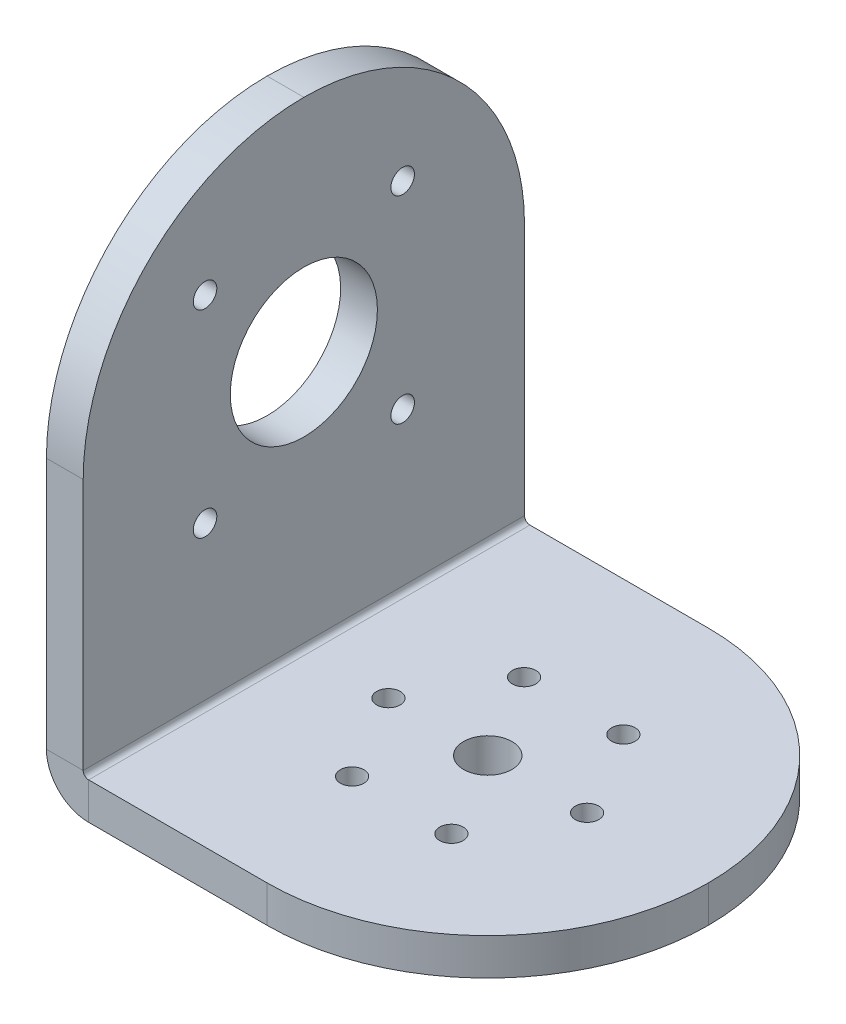
ISO-10303-21;
HEADER;
FILE_DESCRIPTION(('STEP AP214'),'2;1');
FILE_NAME('part.step','',(''),(''),'','','');
FILE_SCHEMA(('AUTOMOTIVE_DESIGN { 1 0 10303 214 1 1 1 1 }'));
ENDSEC;
DATA;
#1=APPLICATION_CONTEXT('core data for automotive mechanical design processes');
#2=APPLICATION_PROTOCOL_DEFINITION('international standard','automotive_design',2000,#1);
#3=PRODUCT_CONTEXT('',#1,'mechanical');
#4=PRODUCT('Part','Part','',(#3));
#5=PRODUCT_RELATED_PRODUCT_CATEGORY('part','',(#4));
#6=PRODUCT_DEFINITION_FORMATION('','',#4);
#7=PRODUCT_DEFINITION_CONTEXT('part definition',#1,'design');
#8=PRODUCT_DEFINITION('design','',#6,#7);
#9=PRODUCT_DEFINITION_SHAPE('','',#8);
#10=(LENGTH_UNIT() NAMED_UNIT(*) SI_UNIT(.MILLI.,.METRE.));
#11=(NAMED_UNIT(*) PLANE_ANGLE_UNIT() SI_UNIT($,.RADIAN.));
#12=(NAMED_UNIT(*) SI_UNIT($,.STERADIAN.) SOLID_ANGLE_UNIT());
#13=UNCERTAINTY_MEASURE_WITH_UNIT(LENGTH_MEASURE(1.E-05),#10,'distance_accuracy_value','');
#14=(GEOMETRIC_REPRESENTATION_CONTEXT(3) GLOBAL_UNCERTAINTY_ASSIGNED_CONTEXT((#13)) GLOBAL_UNIT_ASSIGNED_CONTEXT((#10,
#11,#12)) REPRESENTATION_CONTEXT('',''));
#15=CARTESIAN_POINT('',(0.,0.,0.));
#16=DIRECTION('',(0.,0.,1.));
#17=DIRECTION('',(1.,0.,0.));
#18=AXIS2_PLACEMENT_3D('',#15,#16,#17);
#19=CARTESIAN_POINT('',(0.,70.,30.));
#20=DIRECTION('',(1.,0.,0.));
#21=DIRECTION('',(0.,1.,0.));
#22=AXIS2_PLACEMENT_3D('',#19,#20,#21);
#23=PLANE('',#22);
#24=CARTESIAN_POINT('',(0.,53.4350288425444,-13.4350288425444));
#25=DIRECTION('',(-1.,0.,0.));
#26=DIRECTION('',(0.,0.,1.));
#27=AXIS2_PLACEMENT_3D('',#24,#25,#26);
#28=CIRCLE('',#27,1.60000000000002);
#29=CARTESIAN_POINT('',(0.,53.4350288425444,-11.8350288425444));
#30=VERTEX_POINT('',#29);
#31=EDGE_CURVE('E308',#30,#30,#28,.T.);
#32=ORIENTED_EDGE('',*,*,#31,.F.);
#33=EDGE_LOOP('',(#32));
#34=FACE_BOUND('',#33,.T.);
#35=CARTESIAN_POINT('',(0.,26.5649711574556,-13.4350288425444));
#36=DIRECTION('',(-1.,0.,0.));
#37=DIRECTION('',(0.,0.,1.));
#38=AXIS2_PLACEMENT_3D('',#35,#36,#37);
#39=CIRCLE('',#38,1.60000000000001);
#40=CARTESIAN_POINT('',(0.,26.5649711574556,-11.8350288425444));
#41=VERTEX_POINT('',#40);
#42=EDGE_CURVE('E302',#41,#41,#39,.T.);
#43=ORIENTED_EDGE('',*,*,#42,.F.);
#44=EDGE_LOOP('',(#43));
#45=FACE_BOUND('',#44,.T.);
#46=CARTESIAN_POINT('',(0.,26.5649711574556,13.4350288425444));
#47=DIRECTION('',(-1.,0.,0.));
#48=DIRECTION('',(0.,0.,1.));
#49=AXIS2_PLACEMENT_3D('',#46,#47,#48);
#50=CIRCLE('',#49,1.60000000000001);
#51=CARTESIAN_POINT('',(0.,26.5649711574556,15.0350288425444));
#52=VERTEX_POINT('',#51);
#53=EDGE_CURVE('E296',#52,#52,#50,.T.);
#54=ORIENTED_EDGE('',*,*,#53,.F.);
#55=EDGE_LOOP('',(#54));
#56=FACE_BOUND('',#55,.T.);
#57=CARTESIAN_POINT('',(0.,40.,0.));
#58=DIRECTION('',(-1.,0.,0.));
#59=DIRECTION('',(0.,-1.,0.));
#60=AXIS2_PLACEMENT_3D('',#57,#58,#59);
#61=CIRCLE('',#60,10.);
#62=CARTESIAN_POINT('',(0.,30.,0.));
#63=VERTEX_POINT('',#62);
#64=EDGE_CURVE('E290',#63,#63,#61,.T.);
#65=ORIENTED_EDGE('',*,*,#64,.F.);
#66=EDGE_LOOP('',(#65));
#67=FACE_BOUND('',#66,.T.);
#68=CARTESIAN_POINT('',(0.,40.,0.));
#69=DIRECTION('',(1.,0.,0.));
#70=DIRECTION('',(0.,1.,0.));
#71=AXIS2_PLACEMENT_3D('',#68,#69,#70);
#72=CIRCLE('',#71,30.);
#73=CARTESIAN_POINT('',(0.,40.,30.));
#74=VERTEX_POINT('',#73);
#75=CARTESIAN_POINT('',(0.,70.,0.));
#76=VERTEX_POINT('',#75);
#77=EDGE_CURVE('E60',#74,#76,#72,.F.);
#78=ORIENTED_EDGE('',*,*,#77,.T.);
#79=CARTESIAN_POINT('',(0.,40.,0.));
#80=DIRECTION('',(1.,0.,0.));
#81=DIRECTION('',(0.,1.,0.));
#82=AXIS2_PLACEMENT_3D('',#79,#80,#81);
#83=CIRCLE('',#82,30.);
#84=CARTESIAN_POINT('',(0.,40.,-30.));
#85=VERTEX_POINT('',#84);
#86=EDGE_CURVE('E52',#76,#85,#83,.F.);
#87=ORIENTED_EDGE('',*,*,#86,.T.);
#88=DIRECTION('',(0.,-1.,0.));
#89=VECTOR('',#88,1.);
#90=CARTESIAN_POINT('',(0.,70.,-30.));
#91=LINE('',#90,#89);
#92=CARTESIAN_POINT('',(0.,5.73659999999999,-30.));
#93=VERTEX_POINT('',#92);
#94=EDGE_CURVE('E178',#85,#93,#91,.T.);
#95=ORIENTED_EDGE('',*,*,#94,.T.);
#96=DIRECTION('',(0.,0.,-1.));
#97=VECTOR('',#96,1.);
#98=CARTESIAN_POINT('',(0.,5.73659999999999,30.));
#99=LINE('',#98,#97);
#100=CARTESIAN_POINT('',(0.,5.73659999999999,30.));
#101=VERTEX_POINT('',#100);
#102=EDGE_CURVE('E185',#101,#93,#99,.T.);
#103=ORIENTED_EDGE('',*,*,#102,.F.);
#104=DIRECTION('',(0.,-1.,0.));
#105=VECTOR('',#104,1.);
#106=CARTESIAN_POINT('',(0.,70.,30.));
#107=LINE('',#106,#105);
#108=EDGE_CURVE('E162',#74,#101,#107,.T.);
#109=ORIENTED_EDGE('',*,*,#108,.F.);
#110=EDGE_LOOP('',(#78,#87,#95,#103,#109));
#111=FACE_BOUND('',#110,.T.);
#112=CARTESIAN_POINT('',(0.,53.4350288425444,13.4350288425444));
#113=DIRECTION('',(-1.,0.,0.));
#114=DIRECTION('',(0.,0.,1.));
#115=AXIS2_PLACEMENT_3D('',#112,#113,#114);
#116=CIRCLE('',#115,1.60000000000002);
#117=CARTESIAN_POINT('',(0.,53.4350288425444,15.0350288425444));
#118=VERTEX_POINT('',#117);
#119=EDGE_CURVE('E216',#118,#118,#116,.T.);
#120=ORIENTED_EDGE('',*,*,#119,.F.);
#121=EDGE_LOOP('',(#120));
#122=FACE_BOUND('',#121,.T.);
#123=ADVANCED_FACE('F43',(#34,#45,#56,#67,#111,#122),#23,.F.);
#124=CARTESIAN_POINT('',(0.,5.73659999999999,30.));
#125=DIRECTION('',(0.,0.,1.));
#126=DIRECTION('',(1.,0.,0.));
#127=AXIS2_PLACEMENT_3D('',#124,#125,#126);
#128=PLANE('',#127);
#129=DIRECTION('',(1.,0.,0.));
#130=VECTOR('',#129,1.);
#131=CARTESIAN_POINT('',(0.,5.73659999999999,30.));
#132=LINE('',#131,#130);
#133=CARTESIAN_POINT('',(5.,5.7366,30.));
#134=VERTEX_POINT('',#133);
#135=EDGE_CURVE('E133',#101,#134,#132,.T.);
#136=ORIENTED_EDGE('',*,*,#135,.F.);
#137=CARTESIAN_POINT('',(5.7366,5.7366,30.));
#138=DIRECTION('',(0.,0.,1.));
#139=DIRECTION('',(1.,0.,0.));
#140=AXIS2_PLACEMENT_3D('',#137,#138,#139);
#141=CIRCLE('',#140,5.7366);
#142=CARTESIAN_POINT('',(5.7366,0.,30.));
#143=VERTEX_POINT('',#142);
#144=EDGE_CURVE('E128',#101,#143,#141,.T.);
#145=ORIENTED_EDGE('',*,*,#144,.T.);
#146=DIRECTION('',(0.,-1.,0.));
#147=VECTOR('',#146,1.);
#148=CARTESIAN_POINT('',(5.7366,5.,30.));
#149=LINE('',#148,#147);
#150=CARTESIAN_POINT('',(5.7366,5.,30.));
#151=VERTEX_POINT('',#150);
#152=EDGE_CURVE('E121',#151,#143,#149,.T.);
#153=ORIENTED_EDGE('',*,*,#152,.F.);
#154=CARTESIAN_POINT('',(5.7366,5.7366,30.));
#155=DIRECTION('',(0.,0.,1.));
#156=DIRECTION('',(1.,0.,0.));
#157=AXIS2_PLACEMENT_3D('',#154,#155,#156);
#158=CIRCLE('',#157,0.7366);
#159=EDGE_CURVE('E126',#134,#151,#158,.T.);
#160=ORIENTED_EDGE('',*,*,#159,.F.);
#161=EDGE_LOOP('',(#136,#145,#153,#160));
#162=FACE_BOUND('',#161,.T.);
#163=ADVANCED_FACE('F124',(#162),#128,.T.);
#164=CARTESIAN_POINT('',(5.7366,5.,30.));
#165=DIRECTION('',(0.,0.,1.));
#166=DIRECTION('',(1.,0.,0.));
#167=AXIS2_PLACEMENT_3D('',#164,#165,#166);
#168=PLANE('',#167);
#169=DIRECTION('',(0.,-1.,0.));
#170=VECTOR('',#169,1.);
#171=CARTESIAN_POINT('',(5.,70.,30.));
#172=LINE('',#171,#170);
#173=CARTESIAN_POINT('',(5.,40.,30.));
#174=VERTEX_POINT('',#173);
#175=EDGE_CURVE('E160',#174,#134,#172,.T.);
#176=ORIENTED_EDGE('',*,*,#175,.F.);
#177=DIRECTION('',(1.,0.,0.));
#178=VECTOR('',#177,1.);
#179=CARTESIAN_POINT('',(5.7366,40.,30.));
#180=LINE('',#179,#178);
#181=EDGE_CURVE('E11',#174,#74,#180,.F.);
#182=ORIENTED_EDGE('',*,*,#181,.T.);
#183=ORIENTED_EDGE('',*,*,#108,.T.);
#184=ORIENTED_EDGE('',*,*,#135,.T.);
#185=EDGE_LOOP('',(#176,#182,#183,#184));
#186=FACE_BOUND('',#185,.T.);
#187=ADVANCED_FACE('F233',(#186),#168,.T.);
#188=CARTESIAN_POINT('',(5.7366,0.,-30.));
#189=DIRECTION('',(0.,0.,-1.));
#190=DIRECTION('',(-1.,0.,0.));
#191=AXIS2_PLACEMENT_3D('',#188,#189,#190);
#192=PLANE('',#191);
#193=DIRECTION('',(0.,1.,0.));
#194=VECTOR('',#193,1.);
#195=CARTESIAN_POINT('',(5.7366,0.,-30.));
#196=LINE('',#195,#194);
#197=CARTESIAN_POINT('',(5.7366,0.,-30.));
#198=VERTEX_POINT('',#197);
#199=CARTESIAN_POINT('',(5.7366,5.,-30.));
#200=VERTEX_POINT('',#199);
#201=EDGE_CURVE('E134',#198,#200,#196,.T.);
#202=ORIENTED_EDGE('',*,*,#201,.F.);
#203=CARTESIAN_POINT('',(5.7366,5.7366,-30.));
#204=DIRECTION('',(0.,0.,1.));
#205=DIRECTION('',(1.,0.,0.));
#206=AXIS2_PLACEMENT_3D('',#203,#204,#205);
#207=CIRCLE('',#206,5.7366);
#208=EDGE_CURVE('E180',#93,#198,#207,.T.);
#209=ORIENTED_EDGE('',*,*,#208,.F.);
#210=DIRECTION('',(-1.,0.,0.));
#211=VECTOR('',#210,1.);
#212=CARTESIAN_POINT('',(5.,5.7366,-30.));
#213=LINE('',#212,#211);
#214=CARTESIAN_POINT('',(5.,5.7366,-30.));
#215=VERTEX_POINT('',#214);
#216=EDGE_CURVE('E149',#215,#93,#213,.T.);
#217=ORIENTED_EDGE('',*,*,#216,.F.);
#218=CARTESIAN_POINT('',(5.7366,5.7366,-30.));
#219=DIRECTION('',(0.,0.,1.));
#220=DIRECTION('',(1.,0.,0.));
#221=AXIS2_PLACEMENT_3D('',#218,#219,#220);
#222=CIRCLE('',#221,0.7366);
#223=EDGE_CURVE('E174',#215,#200,#222,.T.);
#224=ORIENTED_EDGE('',*,*,#223,.T.);
#225=EDGE_LOOP('',(#202,#209,#217,#224));
#226=FACE_BOUND('',#225,.T.);
#227=ADVANCED_FACE('F360',(#226),#192,.T.);
#228=CARTESIAN_POINT('',(5.,5.7366,-30.));
#229=DIRECTION('',(0.,0.,-1.));
#230=DIRECTION('',(-1.,0.,0.));
#231=AXIS2_PLACEMENT_3D('',#228,#229,#230);
#232=PLANE('',#231);
#233=DIRECTION('',(1.,0.,0.));
#234=VECTOR('',#233,1.);
#235=CARTESIAN_POINT('',(60.,5.,-30.));
#236=LINE('',#235,#234);
#237=CARTESIAN_POINT('',(30.,5.,-30.));
#238=VERTEX_POINT('',#237);
#239=EDGE_CURVE('E145',#200,#238,#236,.T.);
#240=ORIENTED_EDGE('',*,*,#239,.T.);
#241=DIRECTION('',(0.,-1.,0.));
#242=VECTOR('',#241,1.);
#243=CARTESIAN_POINT('',(30.,5.7366,-30.));
#244=LINE('',#243,#242);
#245=CARTESIAN_POINT('',(30.,0.,-30.));
#246=VERTEX_POINT('',#245);
#247=EDGE_CURVE('E194',#238,#246,#244,.T.);
#248=ORIENTED_EDGE('',*,*,#247,.T.);
#249=DIRECTION('',(1.,0.,0.));
#250=VECTOR('',#249,1.);
#251=CARTESIAN_POINT('',(60.,0.,-30.));
#252=LINE('',#251,#250);
#253=EDGE_CURVE('E169',#198,#246,#252,.T.);
#254=ORIENTED_EDGE('',*,*,#253,.F.);
#255=ORIENTED_EDGE('',*,*,#201,.T.);
#256=EDGE_LOOP('',(#240,#248,#254,#255));
#257=FACE_BOUND('',#256,.T.);
#258=ADVANCED_FACE('F356',(#257),#232,.T.);
#259=CARTESIAN_POINT('',(60.,0.,30.));
#260=DIRECTION('',(0.,1.,0.));
#261=DIRECTION('',(-1.,0.,0.));
#262=AXIS2_PLACEMENT_3D('',#259,#260,#261);
#263=PLANE('',#262);
#264=CARTESIAN_POINT('',(36.75,0.,11.6913429510899));
#265=DIRECTION('',(0.,1.,0.));
#266=DIRECTION('',(-1.,0.,0.));
#267=AXIS2_PLACEMENT_3D('',#264,#265,#266);
#268=CIRCLE('',#267,1.60000000000001);
#269=CARTESIAN_POINT('',(35.15,0.,11.6913429510899));
#270=VERTEX_POINT('',#269);
#271=EDGE_CURVE('E281',#270,#270,#268,.T.);
#272=ORIENTED_EDGE('',*,*,#271,.T.);
#273=EDGE_LOOP('',(#272));
#274=FACE_BOUND('',#273,.T.);
#275=CARTESIAN_POINT('',(43.5,0.,0.));
#276=DIRECTION('',(0.,1.,0.));
#277=DIRECTION('',(-1.,0.,0.));
#278=AXIS2_PLACEMENT_3D('',#275,#276,#277);
#279=CIRCLE('',#278,1.60000000000001);
#280=CARTESIAN_POINT('',(41.9,0.,0.));
#281=VERTEX_POINT('',#280);
#282=EDGE_CURVE('E275',#281,#281,#279,.T.);
#283=ORIENTED_EDGE('',*,*,#282,.T.);
#284=EDGE_LOOP('',(#283));
#285=FACE_BOUND('',#284,.T.);
#286=CARTESIAN_POINT('',(36.75,0.,-11.6913429510899));
#287=DIRECTION('',(0.,1.,0.));
#288=DIRECTION('',(-1.,0.,0.));
#289=AXIS2_PLACEMENT_3D('',#286,#287,#288);
#290=CIRCLE('',#289,1.60000000000001);
#291=CARTESIAN_POINT('',(35.15,0.,-11.6913429510899));
#292=VERTEX_POINT('',#291);
#293=EDGE_CURVE('E269',#292,#292,#290,.T.);
#294=ORIENTED_EDGE('',*,*,#293,.T.);
#295=EDGE_LOOP('',(#294));
#296=FACE_BOUND('',#295,.T.);
#297=CARTESIAN_POINT('',(23.25,0.,-11.6913429510899));
#298=DIRECTION('',(0.,1.,0.));
#299=DIRECTION('',(-1.,0.,0.));
#300=AXIS2_PLACEMENT_3D('',#297,#298,#299);
#301=CIRCLE('',#300,1.60000000000001);
#302=CARTESIAN_POINT('',(21.65,0.,-11.6913429510899));
#303=VERTEX_POINT('',#302);
#304=EDGE_CURVE('E263',#303,#303,#301,.T.);
#305=ORIENTED_EDGE('',*,*,#304,.T.);
#306=EDGE_LOOP('',(#305));
#307=FACE_BOUND('',#306,.T.);
#308=CARTESIAN_POINT('',(16.5,0.,0.));
#309=DIRECTION('',(0.,1.,0.));
#310=DIRECTION('',(-1.,0.,0.));
#311=AXIS2_PLACEMENT_3D('',#308,#309,#310);
#312=CIRCLE('',#311,1.60000000000001);
#313=CARTESIAN_POINT('',(14.9,0.,0.));
#314=VERTEX_POINT('',#313);
#315=EDGE_CURVE('E257',#314,#314,#312,.T.);
#316=ORIENTED_EDGE('',*,*,#315,.T.);
#317=EDGE_LOOP('',(#316));
#318=FACE_BOUND('',#317,.T.);
#319=CARTESIAN_POINT('',(23.25,0.,11.6913429510899));
#320=DIRECTION('',(0.,1.,0.));
#321=DIRECTION('',(-1.,0.,0.));
#322=AXIS2_PLACEMENT_3D('',#319,#320,#321);
#323=CIRCLE('',#322,1.60000000000001);
#324=CARTESIAN_POINT('',(21.65,0.,11.6913429510899));
#325=VERTEX_POINT('',#324);
#326=EDGE_CURVE('E251',#325,#325,#323,.T.);
#327=ORIENTED_EDGE('',*,*,#326,.T.);
#328=EDGE_LOOP('',(#327));
#329=FACE_BOUND('',#328,.T.);
#330=CARTESIAN_POINT('',(30.,0.,0.));
#331=DIRECTION('',(0.,1.,0.));
#332=DIRECTION('',(-1.,0.,0.));
#333=AXIS2_PLACEMENT_3D('',#330,#331,#332);
#334=CIRCLE('',#333,3.29337322835061);
#335=CARTESIAN_POINT('',(26.7066267716494,0.,0.));
#336=VERTEX_POINT('',#335);
#337=EDGE_CURVE('E172',#336,#336,#334,.T.);
#338=ORIENTED_EDGE('',*,*,#337,.T.);
#339=EDGE_LOOP('',(#338));
#340=FACE_BOUND('',#339,.T.);
#341=ORIENTED_EDGE('',*,*,#253,.T.);
#342=CARTESIAN_POINT('',(30.,0.,0.));
#343=DIRECTION('',(0.,1.,0.));
#344=DIRECTION('',(-1.,0.,0.));
#345=AXIS2_PLACEMENT_3D('',#342,#343,#344);
#346=CIRCLE('',#345,30.);
#347=CARTESIAN_POINT('',(60.,0.,0.));
#348=VERTEX_POINT('',#347);
#349=EDGE_CURVE('E199',#246,#348,#346,.F.);
#350=ORIENTED_EDGE('',*,*,#349,.T.);
#351=CARTESIAN_POINT('',(30.,0.,0.));
#352=DIRECTION('',(0.,1.,0.));
#353=DIRECTION('',(-1.,0.,0.));
#354=AXIS2_PLACEMENT_3D('',#351,#352,#353);
#355=CIRCLE('',#354,30.);
#356=CARTESIAN_POINT('',(30.,0.,30.));
#357=VERTEX_POINT('',#356);
#358=EDGE_CURVE('E197',#348,#357,#355,.F.);
#359=ORIENTED_EDGE('',*,*,#358,.T.);
#360=DIRECTION('',(1.,0.,0.));
#361=VECTOR('',#360,1.);
#362=CARTESIAN_POINT('',(60.,0.,30.));
#363=LINE('',#362,#361);
#364=EDGE_CURVE('E155',#143,#357,#363,.T.);
#365=ORIENTED_EDGE('',*,*,#364,.F.);
#366=DIRECTION('',(0.,0.,-1.));
#367=VECTOR('',#366,1.);
#368=CARTESIAN_POINT('',(5.7366,0.,30.));
#369=LINE('',#368,#367);
#370=EDGE_CURVE('E168',#143,#198,#369,.T.);
#371=ORIENTED_EDGE('',*,*,#370,.T.);
#372=EDGE_LOOP('',(#341,#350,#359,#365,#371));
#373=FACE_BOUND('',#372,.T.);
#374=ADVANCED_FACE('F243',(#274,#285,#296,#307,#318,#329,#340,#373),#263,.F.);
#375=CARTESIAN_POINT('',(60.,5.,30.));
#376=DIRECTION('',(0.,1.,0.));
#377=DIRECTION('',(-1.,0.,0.));
#378=AXIS2_PLACEMENT_3D('',#375,#376,#377);
#379=PLANE('',#378);
#380=CARTESIAN_POINT('',(36.75,5.,11.6913429510899));
#381=DIRECTION('',(0.,1.,0.));
#382=DIRECTION('',(0.,0.,1.));
#383=AXIS2_PLACEMENT_3D('',#380,#381,#382);
#384=CIRCLE('',#383,1.60000000000001);
#385=CARTESIAN_POINT('',(36.75,5.,13.2913429510899));
#386=VERTEX_POINT('',#385);
#387=EDGE_CURVE('E284',#386,#386,#384,.T.);
#388=ORIENTED_EDGE('',*,*,#387,.F.);
#389=EDGE_LOOP('',(#388));
#390=FACE_BOUND('',#389,.T.);
#391=CARTESIAN_POINT('',(43.5,5.,0.));
#392=DIRECTION('',(0.,1.,0.));
#393=DIRECTION('',(0.,0.,1.));
#394=AXIS2_PLACEMENT_3D('',#391,#392,#393);
#395=CIRCLE('',#394,1.60000000000002);
#396=CARTESIAN_POINT('',(43.5,5.,1.60000000000003));
#397=VERTEX_POINT('',#396);
#398=EDGE_CURVE('E278',#397,#397,#395,.T.);
#399=ORIENTED_EDGE('',*,*,#398,.F.);
#400=EDGE_LOOP('',(#399));
#401=FACE_BOUND('',#400,.T.);
#402=CARTESIAN_POINT('',(36.75,5.,-11.6913429510899));
#403=DIRECTION('',(0.,1.,0.));
#404=DIRECTION('',(0.,0.,1.));
#405=AXIS2_PLACEMENT_3D('',#402,#403,#404);
#406=CIRCLE('',#405,1.60000000000002);
#407=CARTESIAN_POINT('',(36.75,5.,-10.0913429510899));
#408=VERTEX_POINT('',#407);
#409=EDGE_CURVE('E272',#408,#408,#406,.T.);
#410=ORIENTED_EDGE('',*,*,#409,.F.);
#411=EDGE_LOOP('',(#410));
#412=FACE_BOUND('',#411,.T.);
#413=CARTESIAN_POINT('',(23.25,5.,-11.6913429510899));
#414=DIRECTION('',(0.,1.,0.));
#415=DIRECTION('',(0.,0.,1.));
#416=AXIS2_PLACEMENT_3D('',#413,#414,#415);
#417=CIRCLE('',#416,1.60000000000001);
#418=CARTESIAN_POINT('',(23.25,5.,-10.0913429510899));
#419=VERTEX_POINT('',#418);
#420=EDGE_CURVE('E266',#419,#419,#417,.T.);
#421=ORIENTED_EDGE('',*,*,#420,.F.);
#422=EDGE_LOOP('',(#421));
#423=FACE_BOUND('',#422,.T.);
#424=CARTESIAN_POINT('',(16.5,5.,0.));
#425=DIRECTION('',(0.,1.,0.));
#426=DIRECTION('',(0.,0.,1.));
#427=AXIS2_PLACEMENT_3D('',#424,#425,#426);
#428=CIRCLE('',#427,1.60000000000001);
#429=CARTESIAN_POINT('',(16.5,5.,1.60000000000001));
#430=VERTEX_POINT('',#429);
#431=EDGE_CURVE('E260',#430,#430,#428,.T.);
#432=ORIENTED_EDGE('',*,*,#431,.F.);
#433=EDGE_LOOP('',(#432));
#434=FACE_BOUND('',#433,.T.);
#435=CARTESIAN_POINT('',(23.25,5.,11.6913429510899));
#436=DIRECTION('',(0.,1.,0.));
#437=DIRECTION('',(0.,0.,1.));
#438=AXIS2_PLACEMENT_3D('',#435,#436,#437);
#439=CIRCLE('',#438,1.60000000000001);
#440=CARTESIAN_POINT('',(23.25,5.,13.2913429510899));
#441=VERTEX_POINT('',#440);
#442=EDGE_CURVE('E254',#441,#441,#439,.T.);
#443=ORIENTED_EDGE('',*,*,#442,.F.);
#444=EDGE_LOOP('',(#443));
#445=FACE_BOUND('',#444,.T.);
#446=CARTESIAN_POINT('',(30.,5.,0.));
#447=DIRECTION('',(0.,1.,0.));
#448=DIRECTION('',(-1.,0.,0.));
#449=AXIS2_PLACEMENT_3D('',#446,#447,#448);
#450=CIRCLE('',#449,3.29337322835061);
#451=CARTESIAN_POINT('',(26.7066267716494,5.,0.));
#452=VERTEX_POINT('',#451);
#453=EDGE_CURVE('E248',#452,#452,#450,.T.);
#454=ORIENTED_EDGE('',*,*,#453,.F.);
#455=EDGE_LOOP('',(#454));
#456=FACE_BOUND('',#455,.T.);
#457=CARTESIAN_POINT('',(30.,5.,0.));
#458=DIRECTION('',(0.,1.,0.));
#459=DIRECTION('',(-1.,0.,0.));
#460=AXIS2_PLACEMENT_3D('',#457,#458,#459);
#461=CIRCLE('',#460,30.);
#462=CARTESIAN_POINT('',(30.,5.,30.));
#463=VERTEX_POINT('',#462);
#464=CARTESIAN_POINT('',(60.,5.,0.));
#465=VERTEX_POINT('',#464);
#466=EDGE_CURVE('E201',#463,#465,#461,.T.);
#467=ORIENTED_EDGE('',*,*,#466,.T.);
#468=CARTESIAN_POINT('',(30.,5.,0.));
#469=DIRECTION('',(0.,1.,0.));
#470=DIRECTION('',(-1.,0.,0.));
#471=AXIS2_PLACEMENT_3D('',#468,#469,#470);
#472=CIRCLE('',#471,30.);
#473=EDGE_CURVE('E203',#465,#238,#472,.T.);
#474=ORIENTED_EDGE('',*,*,#473,.T.);
#475=ORIENTED_EDGE('',*,*,#239,.F.);
#476=DIRECTION('',(0.,0.,-1.));
#477=VECTOR('',#476,1.);
#478=CARTESIAN_POINT('',(5.7366,5.,30.));
#479=LINE('',#478,#477);
#480=EDGE_CURVE('E140',#151,#200,#479,.T.);
#481=ORIENTED_EDGE('',*,*,#480,.F.);
#482=DIRECTION('',(1.,0.,0.));
#483=VECTOR('',#482,1.);
#484=CARTESIAN_POINT('',(60.,5.,30.));
#485=LINE('',#484,#483);
#486=EDGE_CURVE('E142',#151,#463,#485,.T.);
#487=ORIENTED_EDGE('',*,*,#486,.T.);
#488=EDGE_LOOP('',(#467,#474,#475,#481,#487));
#489=FACE_BOUND('',#488,.T.);
#490=ADVANCED_FACE('F141',(#390,#401,#412,#423,#434,#445,#456,#489),#379,.T.);
#491=CARTESIAN_POINT('',(5.7366,5.7366,30.));
#492=DIRECTION('',(0.,0.,-1.));
#493=DIRECTION('',(-1.,0.,0.));
#494=AXIS2_PLACEMENT_3D('',#491,#492,#493);
#495=CYLINDRICAL_SURFACE('',#494,0.7366);
#496=ORIENTED_EDGE('',*,*,#223,.F.);
#497=DIRECTION('',(0.,0.,-1.));
#498=VECTOR('',#497,1.);
#499=CARTESIAN_POINT('',(5.,5.7366,30.));
#500=LINE('',#499,#498);
#501=EDGE_CURVE('E150',#134,#215,#500,.T.);
#502=ORIENTED_EDGE('',*,*,#501,.F.);
#503=ORIENTED_EDGE('',*,*,#159,.T.);
#504=ORIENTED_EDGE('',*,*,#480,.T.);
#505=EDGE_LOOP('',(#496,#502,#503,#504));
#506=FACE_BOUND('',#505,.T.);
#507=ADVANCED_FACE('F158',(#506),#495,.F.);
#508=CARTESIAN_POINT('',(5.,70.,30.));
#509=DIRECTION('',(1.,0.,0.));
#510=DIRECTION('',(0.,1.,0.));
#511=AXIS2_PLACEMENT_3D('',#508,#509,#510);
#512=PLANE('',#511);
#513=CARTESIAN_POINT('',(5.,53.4350288425444,13.4350288425444));
#514=DIRECTION('',(1.,0.,0.));
#515=DIRECTION('',(0.,1.,0.));
#516=AXIS2_PLACEMENT_3D('',#513,#514,#515);
#517=CIRCLE('',#516,1.60000000000001);
#518=CARTESIAN_POINT('',(5.,55.0350288425444,13.4350288425444));
#519=VERTEX_POINT('',#518);
#520=EDGE_CURVE('E221',#519,#519,#517,.T.);
#521=ORIENTED_EDGE('',*,*,#520,.F.);
#522=EDGE_LOOP('',(#521));
#523=FACE_BOUND('',#522,.T.);
#524=CARTESIAN_POINT('',(5.,53.4350288425444,-13.4350288425444));
#525=DIRECTION('',(1.,0.,0.));
#526=DIRECTION('',(0.,1.,0.));
#527=AXIS2_PLACEMENT_3D('',#524,#525,#526);
#528=CIRCLE('',#527,1.60000000000001);
#529=CARTESIAN_POINT('',(5.,55.0350288425444,-13.4350288425444));
#530=VERTEX_POINT('',#529);
#531=EDGE_CURVE('E305',#530,#530,#528,.T.);
#532=ORIENTED_EDGE('',*,*,#531,.F.);
#533=EDGE_LOOP('',(#532));
#534=FACE_BOUND('',#533,.T.);
#535=CARTESIAN_POINT('',(5.,26.5649711574556,-13.4350288425444));
#536=DIRECTION('',(1.,0.,0.));
#537=DIRECTION('',(0.,1.,0.));
#538=AXIS2_PLACEMENT_3D('',#535,#536,#537);
#539=CIRCLE('',#538,1.60000000000001);
#540=CARTESIAN_POINT('',(5.,28.1649711574556,-13.4350288425444));
#541=VERTEX_POINT('',#540);
#542=EDGE_CURVE('E299',#541,#541,#539,.T.);
#543=ORIENTED_EDGE('',*,*,#542,.F.);
#544=EDGE_LOOP('',(#543));
#545=FACE_BOUND('',#544,.T.);
#546=CARTESIAN_POINT('',(5.,26.5649711574556,13.4350288425444));
#547=DIRECTION('',(1.,0.,0.));
#548=DIRECTION('',(0.,1.,0.));
#549=AXIS2_PLACEMENT_3D('',#546,#547,#548);
#550=CIRCLE('',#549,1.60000000000001);
#551=CARTESIAN_POINT('',(5.,28.1649711574556,13.4350288425444));
#552=VERTEX_POINT('',#551);
#553=EDGE_CURVE('E293',#552,#552,#550,.T.);
#554=ORIENTED_EDGE('',*,*,#553,.F.);
#555=EDGE_LOOP('',(#554));
#556=FACE_BOUND('',#555,.T.);
#557=CARTESIAN_POINT('',(5.,40.,0.));
#558=DIRECTION('',(1.,0.,0.));
#559=DIRECTION('',(0.,1.,0.));
#560=AXIS2_PLACEMENT_3D('',#557,#558,#559);
#561=CIRCLE('',#560,10.);
#562=CARTESIAN_POINT('',(5.,50.,0.));
#563=VERTEX_POINT('',#562);
#564=EDGE_CURVE('E287',#563,#563,#561,.T.);
#565=ORIENTED_EDGE('',*,*,#564,.F.);
#566=EDGE_LOOP('',(#565));
#567=FACE_BOUND('',#566,.T.);
#568=DIRECTION('',(0.,-1.,0.));
#569=VECTOR('',#568,1.);
#570=CARTESIAN_POINT('',(5.,70.,-30.));
#571=LINE('',#570,#569);
#572=CARTESIAN_POINT('',(5.,40.,-30.));
#573=VERTEX_POINT('',#572);
#574=EDGE_CURVE('E176',#573,#215,#571,.T.);
#575=ORIENTED_EDGE('',*,*,#574,.F.);
#576=CARTESIAN_POINT('',(5.,40.,0.));
#577=DIRECTION('',(1.,0.,0.));
#578=DIRECTION('',(0.,1.,0.));
#579=AXIS2_PLACEMENT_3D('',#576,#577,#578);
#580=CIRCLE('',#579,30.);
#581=CARTESIAN_POINT('',(5.,70.,0.));
#582=VERTEX_POINT('',#581);
#583=EDGE_CURVE('E211',#573,#582,#580,.T.);
#584=ORIENTED_EDGE('',*,*,#583,.T.);
#585=CARTESIAN_POINT('',(5.,40.,0.));
#586=DIRECTION('',(1.,0.,0.));
#587=DIRECTION('',(0.,1.,0.));
#588=AXIS2_PLACEMENT_3D('',#585,#586,#587);
#589=CIRCLE('',#588,30.);
#590=EDGE_CURVE('E209',#582,#174,#589,.T.);
#591=ORIENTED_EDGE('',*,*,#590,.T.);
#592=ORIENTED_EDGE('',*,*,#175,.T.);
#593=ORIENTED_EDGE('',*,*,#501,.T.);
#594=EDGE_LOOP('',(#575,#584,#591,#592,#593));
#595=FACE_BOUND('',#594,.T.);
#596=ADVANCED_FACE('F232',(#523,#534,#545,#556,#567,#595),#512,.T.);
#597=CARTESIAN_POINT('',(5.7366,5.7366,30.));
#598=DIRECTION('',(0.,0.,-1.));
#599=DIRECTION('',(-1.,0.,0.));
#600=AXIS2_PLACEMENT_3D('',#597,#598,#599);
#601=CYLINDRICAL_SURFACE('',#600,5.7366);
#602=ORIENTED_EDGE('',*,*,#208,.T.);
#603=ORIENTED_EDGE('',*,*,#370,.F.);
#604=ORIENTED_EDGE('',*,*,#144,.F.);
#605=ORIENTED_EDGE('',*,*,#102,.T.);
#606=EDGE_LOOP('',(#602,#603,#604,#605));
#607=FACE_BOUND('',#606,.T.);
#608=ADVANCED_FACE('F239',(#607),#601,.T.);
#609=CARTESIAN_POINT('',(5.7366,5.7366,30.));
#610=DIRECTION('',(0.,0.,1.));
#611=DIRECTION('',(1.,0.,0.));
#612=AXIS2_PLACEMENT_3D('',#609,#610,#611);
#613=PLANE('',#612);
#614=ORIENTED_EDGE('',*,*,#364,.T.);
#615=DIRECTION('',(0.,-1.,0.));
#616=VECTOR('',#615,1.);
#617=CARTESIAN_POINT('',(30.,5.7366,30.));
#618=LINE('',#617,#616);
#619=EDGE_CURVE('E154',#357,#463,#618,.F.);
#620=ORIENTED_EDGE('',*,*,#619,.T.);
#621=ORIENTED_EDGE('',*,*,#486,.F.);
#622=ORIENTED_EDGE('',*,*,#152,.T.);
#623=EDGE_LOOP('',(#614,#620,#621,#622));
#624=FACE_BOUND('',#623,.T.);
#625=ADVANCED_FACE('F152',(#624),#613,.T.);
#626=CARTESIAN_POINT('',(5.7366,5.7366,-30.));
#627=DIRECTION('',(0.,0.,1.));
#628=DIRECTION('',(1.,0.,0.));
#629=AXIS2_PLACEMENT_3D('',#626,#627,#628);
#630=PLANE('',#629);
#631=ORIENTED_EDGE('',*,*,#94,.F.);
#632=DIRECTION('',(1.,0.,0.));
#633=VECTOR('',#632,1.);
#634=CARTESIAN_POINT('',(5.,40.,-30.));
#635=LINE('',#634,#633);
#636=EDGE_CURVE('E206',#85,#573,#635,.T.);
#637=ORIENTED_EDGE('',*,*,#636,.T.);
#638=ORIENTED_EDGE('',*,*,#574,.T.);
#639=ORIENTED_EDGE('',*,*,#216,.T.);
#640=EDGE_LOOP('',(#631,#637,#638,#639));
#641=FACE_BOUND('',#640,.T.);
#642=ADVANCED_FACE('F393',(#641),#630,.F.);
#643=CARTESIAN_POINT('',(30.,-5.,0.));
#644=DIRECTION('',(0.,1.,0.));
#645=DIRECTION('',(-1.,0.,0.));
#646=AXIS2_PLACEMENT_3D('',#643,#644,#645);
#647=CYLINDRICAL_SURFACE('',#646,3.29337322835061);
#648=ORIENTED_EDGE('',*,*,#453,.T.);
#649=EDGE_LOOP('',(#648));
#650=FACE_BOUND('',#649,.T.);
#651=ORIENTED_EDGE('',*,*,#337,.F.);
#652=EDGE_LOOP('',(#651));
#653=FACE_BOUND('',#652,.T.);
#654=ADVANCED_FACE('F397',(#650,#653),#647,.F.);
#655=CARTESIAN_POINT('',(23.25,5.,11.6913429510899));
#656=DIRECTION('',(0.,1.,0.));
#657=DIRECTION('',(0.,0.,1.));
#658=AXIS2_PLACEMENT_3D('',#655,#656,#657);
#659=CYLINDRICAL_SURFACE('',#658,1.60000000000001);
#660=ORIENTED_EDGE('',*,*,#326,.F.);
#661=EDGE_LOOP('',(#660));
#662=FACE_BOUND('',#661,.T.);
#663=ORIENTED_EDGE('',*,*,#442,.T.);
#664=EDGE_LOOP('',(#663));
#665=FACE_BOUND('',#664,.T.);
#666=ADVANCED_FACE('F462',(#662,#665),#659,.F.);
#667=CARTESIAN_POINT('',(16.5,5.,0.));
#668=DIRECTION('',(0.,1.,0.));
#669=DIRECTION('',(0.,0.,1.));
#670=AXIS2_PLACEMENT_3D('',#667,#668,#669);
#671=CYLINDRICAL_SURFACE('',#670,1.60000000000001);
#672=ORIENTED_EDGE('',*,*,#315,.F.);
#673=EDGE_LOOP('',(#672));
#674=FACE_BOUND('',#673,.T.);
#675=ORIENTED_EDGE('',*,*,#431,.T.);
#676=EDGE_LOOP('',(#675));
#677=FACE_BOUND('',#676,.T.);
#678=ADVANCED_FACE('F471',(#674,#677),#671,.F.);
#679=CARTESIAN_POINT('',(23.25,5.,-11.6913429510899));
#680=DIRECTION('',(0.,1.,0.));
#681=DIRECTION('',(0.,0.,1.));
#682=AXIS2_PLACEMENT_3D('',#679,#680,#681);
#683=CYLINDRICAL_SURFACE('',#682,1.60000000000001);
#684=ORIENTED_EDGE('',*,*,#304,.F.);
#685=EDGE_LOOP('',(#684));
#686=FACE_BOUND('',#685,.T.);
#687=ORIENTED_EDGE('',*,*,#420,.T.);
#688=EDGE_LOOP('',(#687));
#689=FACE_BOUND('',#688,.T.);
#690=ADVANCED_FACE('F480',(#686,#689),#683,.F.);
#691=CARTESIAN_POINT('',(36.75,5.,-11.6913429510899));
#692=DIRECTION('',(0.,1.,0.));
#693=DIRECTION('',(0.,0.,1.));
#694=AXIS2_PLACEMENT_3D('',#691,#692,#693);
#695=CYLINDRICAL_SURFACE('',#694,1.60000000000001);
#696=ORIENTED_EDGE('',*,*,#293,.F.);
#697=EDGE_LOOP('',(#696));
#698=FACE_BOUND('',#697,.T.);
#699=ORIENTED_EDGE('',*,*,#409,.T.);
#700=EDGE_LOOP('',(#699));
#701=FACE_BOUND('',#700,.T.);
#702=ADVANCED_FACE('F489',(#698,#701),#695,.F.);
#703=CARTESIAN_POINT('',(43.5,5.,0.));
#704=DIRECTION('',(0.,1.,0.));
#705=DIRECTION('',(0.,0.,1.));
#706=AXIS2_PLACEMENT_3D('',#703,#704,#705);
#707=CYLINDRICAL_SURFACE('',#706,1.60000000000001);
#708=ORIENTED_EDGE('',*,*,#282,.F.);
#709=EDGE_LOOP('',(#708));
#710=FACE_BOUND('',#709,.T.);
#711=ORIENTED_EDGE('',*,*,#398,.T.);
#712=EDGE_LOOP('',(#711));
#713=FACE_BOUND('',#712,.T.);
#714=ADVANCED_FACE('F498',(#710,#713),#707,.F.);
#715=CARTESIAN_POINT('',(36.75,5.,11.6913429510899));
#716=DIRECTION('',(0.,1.,0.));
#717=DIRECTION('',(0.,0.,1.));
#718=AXIS2_PLACEMENT_3D('',#715,#716,#717);
#719=CYLINDRICAL_SURFACE('',#718,1.60000000000001);
#720=ORIENTED_EDGE('',*,*,#271,.F.);
#721=EDGE_LOOP('',(#720));
#722=FACE_BOUND('',#721,.T.);
#723=ORIENTED_EDGE('',*,*,#387,.T.);
#724=EDGE_LOOP('',(#723));
#725=FACE_BOUND('',#724,.T.);
#726=ADVANCED_FACE('F331',(#722,#725),#719,.F.);
#727=CARTESIAN_POINT('',(10.,40.,0.));
#728=DIRECTION('',(-1.,0.,0.));
#729=DIRECTION('',(0.,-1.,0.));
#730=AXIS2_PLACEMENT_3D('',#727,#728,#729);
#731=CYLINDRICAL_SURFACE('',#730,10.);
#732=ORIENTED_EDGE('',*,*,#564,.T.);
#733=EDGE_LOOP('',(#732));
#734=FACE_BOUND('',#733,.T.);
#735=ORIENTED_EDGE('',*,*,#64,.T.);
#736=EDGE_LOOP('',(#735));
#737=FACE_BOUND('',#736,.T.);
#738=ADVANCED_FACE('F327',(#734,#737),#731,.F.);
#739=CARTESIAN_POINT('',(0.,26.5649711574556,13.4350288425444));
#740=DIRECTION('',(-1.,0.,0.));
#741=DIRECTION('',(0.,0.,1.));
#742=AXIS2_PLACEMENT_3D('',#739,#740,#741);
#743=CYLINDRICAL_SURFACE('',#742,1.60000000000001);
#744=ORIENTED_EDGE('',*,*,#53,.T.);
#745=EDGE_LOOP('',(#744));
#746=FACE_BOUND('',#745,.T.);
#747=ORIENTED_EDGE('',*,*,#553,.T.);
#748=EDGE_LOOP('',(#747));
#749=FACE_BOUND('',#748,.T.);
#750=ADVANCED_FACE('F330',(#746,#749),#743,.F.);
#751=CARTESIAN_POINT('',(0.,26.5649711574556,-13.4350288425444));
#752=DIRECTION('',(-1.,0.,0.));
#753=DIRECTION('',(0.,0.,1.));
#754=AXIS2_PLACEMENT_3D('',#751,#752,#753);
#755=CYLINDRICAL_SURFACE('',#754,1.60000000000001);
#756=ORIENTED_EDGE('',*,*,#42,.T.);
#757=EDGE_LOOP('',(#756));
#758=FACE_BOUND('',#757,.T.);
#759=ORIENTED_EDGE('',*,*,#542,.T.);
#760=EDGE_LOOP('',(#759));
#761=FACE_BOUND('',#760,.T.);
#762=ADVANCED_FACE('F529',(#758,#761),#755,.F.);
#763=CARTESIAN_POINT('',(0.,53.4350288425444,-13.4350288425444));
#764=DIRECTION('',(-1.,0.,0.));
#765=DIRECTION('',(0.,0.,1.));
#766=AXIS2_PLACEMENT_3D('',#763,#764,#765);
#767=CYLINDRICAL_SURFACE('',#766,1.60000000000001);
#768=ORIENTED_EDGE('',*,*,#31,.T.);
#769=EDGE_LOOP('',(#768));
#770=FACE_BOUND('',#769,.T.);
#771=ORIENTED_EDGE('',*,*,#531,.T.);
#772=EDGE_LOOP('',(#771));
#773=FACE_BOUND('',#772,.T.);
#774=ADVANCED_FACE('F538',(#770,#773),#767,.F.);
#775=CARTESIAN_POINT('',(0.,53.4350288425444,13.4350288425444));
#776=DIRECTION('',(-1.,0.,0.));
#777=DIRECTION('',(0.,0.,1.));
#778=AXIS2_PLACEMENT_3D('',#775,#776,#777);
#779=CYLINDRICAL_SURFACE('',#778,1.60000000000001);
#780=ORIENTED_EDGE('',*,*,#119,.T.);
#781=EDGE_LOOP('',(#780));
#782=FACE_BOUND('',#781,.T.);
#783=ORIENTED_EDGE('',*,*,#520,.T.);
#784=EDGE_LOOP('',(#783));
#785=FACE_BOUND('',#784,.T.);
#786=ADVANCED_FACE('F314',(#782,#785),#779,.F.);
#787=CARTESIAN_POINT('',(30.,5.,0.));
#788=DIRECTION('',(0.,-1.,0.));
#789=DIRECTION('',(0.,0.,-1.));
#790=AXIS2_PLACEMENT_3D('',#787,#788,#789);
#791=CYLINDRICAL_SURFACE('',#790,30.);
#792=DIRECTION('',(0.,-1.,0.));
#793=VECTOR('',#792,1.);
#794=CARTESIAN_POINT('',(60.,5.,0.));
#795=LINE('',#794,#793);
#796=EDGE_CURVE('E214',#465,#348,#795,.T.);
#797=ORIENTED_EDGE('',*,*,#796,.F.);
#798=ORIENTED_EDGE('',*,*,#466,.F.);
#799=ORIENTED_EDGE('',*,*,#619,.F.);
#800=ORIENTED_EDGE('',*,*,#358,.F.);
#801=EDGE_LOOP('',(#797,#798,#799,#800));
#802=FACE_BOUND('',#801,.T.);
#803=ADVANCED_FACE('F369',(#802),#791,.T.);
#804=CARTESIAN_POINT('',(30.,5.7366,0.));
#805=DIRECTION('',(0.,-1.,0.));
#806=DIRECTION('',(0.,0.,-1.));
#807=AXIS2_PLACEMENT_3D('',#804,#805,#806);
#808=CYLINDRICAL_SURFACE('',#807,30.);
#809=ORIENTED_EDGE('',*,*,#473,.F.);
#810=ORIENTED_EDGE('',*,*,#796,.T.);
#811=ORIENTED_EDGE('',*,*,#349,.F.);
#812=ORIENTED_EDGE('',*,*,#247,.F.);
#813=EDGE_LOOP('',(#809,#810,#811,#812));
#814=FACE_BOUND('',#813,.T.);
#815=ADVANCED_FACE('F366',(#814),#808,.T.);
#816=CARTESIAN_POINT('',(0.,40.,0.));
#817=DIRECTION('',(1.,0.,0.));
#818=DIRECTION('',(0.,0.,-1.));
#819=AXIS2_PLACEMENT_3D('',#816,#817,#818);
#820=CYLINDRICAL_SURFACE('',#819,30.);
#821=DIRECTION('',(1.,0.,0.));
#822=VECTOR('',#821,1.);
#823=CARTESIAN_POINT('',(0.,70.,0.));
#824=LINE('',#823,#822);
#825=EDGE_CURVE('E47',#76,#582,#824,.T.);
#826=ORIENTED_EDGE('',*,*,#825,.F.);
#827=ORIENTED_EDGE('',*,*,#77,.F.);
#828=ORIENTED_EDGE('',*,*,#181,.F.);
#829=ORIENTED_EDGE('',*,*,#590,.F.);
#830=EDGE_LOOP('',(#826,#827,#828,#829));
#831=FACE_BOUND('',#830,.T.);
#832=ADVANCED_FACE('F45',(#831),#820,.T.);
#833=CARTESIAN_POINT('',(5.7366,40.,0.));
#834=DIRECTION('',(-1.,0.,0.));
#835=DIRECTION('',(0.,0.,1.));
#836=AXIS2_PLACEMENT_3D('',#833,#834,#835);
#837=CYLINDRICAL_SURFACE('',#836,30.);
#838=ORIENTED_EDGE('',*,*,#86,.F.);
#839=ORIENTED_EDGE('',*,*,#825,.T.);
#840=ORIENTED_EDGE('',*,*,#583,.F.);
#841=ORIENTED_EDGE('',*,*,#636,.F.);
#842=EDGE_LOOP('',(#838,#839,#840,#841));
#843=FACE_BOUND('',#842,.T.);
#844=ADVANCED_FACE('F226',(#843),#837,.T.);
#845=CLOSED_SHELL('',(#123,#163,#187,#227,#258,#374,#490,#507,#596,#608,#625,#642,#654,#666,
#678,#690,#702,#714,#726,#738,#750,#762,#774,#786,#803,#815,#832,#844));
#846=MANIFOLD_SOLID_BREP('B2',#845);
#847=ADVANCED_BREP_SHAPE_REPRESENTATION('',(#18,#846),#14);
#848=SHAPE_DEFINITION_REPRESENTATION(#9,#847);
ENDSEC;
END-ISO-10303-21;
